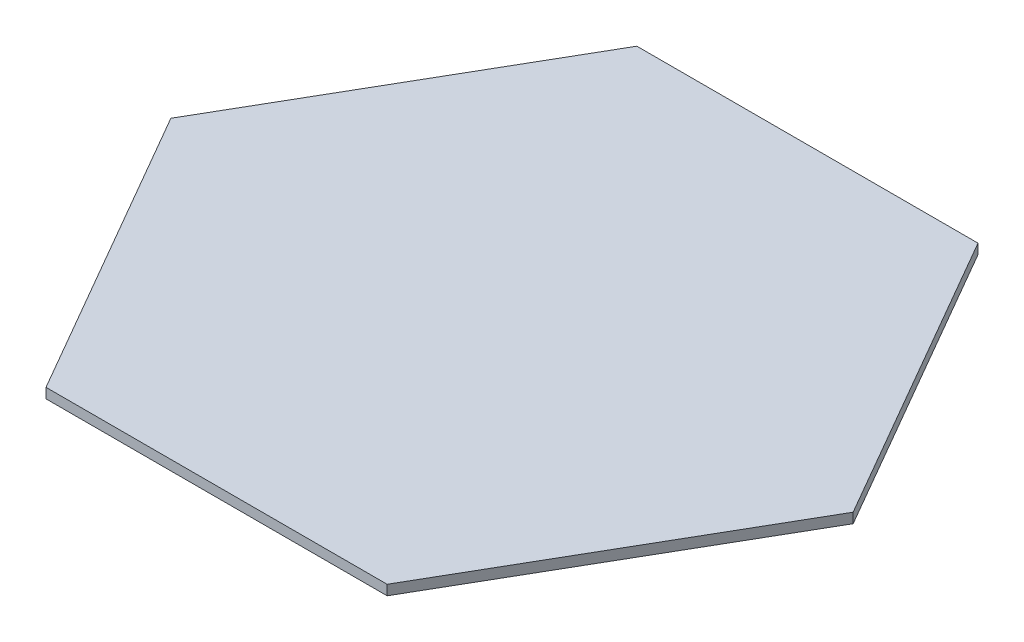
ISO-10303-21;
HEADER;
FILE_DESCRIPTION(('STEP AP214'),'2;1');
FILE_NAME('part.step','',(''),(''),'','','');
FILE_SCHEMA(('AUTOMOTIVE_DESIGN { 1 0 10303 214 1 1 1 1 }'));
ENDSEC;
DATA;
#1=APPLICATION_CONTEXT('core data for automotive mechanical design processes');
#2=APPLICATION_PROTOCOL_DEFINITION('international standard','automotive_design',2000,#1);
#3=PRODUCT_CONTEXT('',#1,'mechanical');
#4=PRODUCT('Part','Part','',(#3));
#5=PRODUCT_RELATED_PRODUCT_CATEGORY('part','',(#4));
#6=PRODUCT_DEFINITION_FORMATION('','',#4);
#7=PRODUCT_DEFINITION_CONTEXT('part definition',#1,'design');
#8=PRODUCT_DEFINITION('design','',#6,#7);
#9=PRODUCT_DEFINITION_SHAPE('','',#8);
#10=(LENGTH_UNIT() NAMED_UNIT(*) SI_UNIT(.MILLI.,.METRE.));
#11=(NAMED_UNIT(*) PLANE_ANGLE_UNIT() SI_UNIT($,.RADIAN.));
#12=(NAMED_UNIT(*) SI_UNIT($,.STERADIAN.) SOLID_ANGLE_UNIT());
#13=UNCERTAINTY_MEASURE_WITH_UNIT(LENGTH_MEASURE(1.E-05),#10,'distance_accuracy_value','');
#14=(GEOMETRIC_REPRESENTATION_CONTEXT(3) GLOBAL_UNCERTAINTY_ASSIGNED_CONTEXT((#13)) GLOBAL_UNIT_ASSIGNED_CONTEXT((#10,
#11,#12)) REPRESENTATION_CONTEXT('',''));
#15=CARTESIAN_POINT('',(0.,0.,0.));
#16=DIRECTION('',(0.,0.,1.));
#17=DIRECTION('',(1.,0.,0.));
#18=AXIS2_PLACEMENT_3D('',#15,#16,#17);
#19=CARTESIAN_POINT('',(-85.25,5.,147.657331345247));
#20=DIRECTION('',(0.,0.,-1.));
#21=DIRECTION('',(-1.,0.,0.));
#22=AXIS2_PLACEMENT_3D('',#19,#20,#21);
#23=PLANE('',#22);
#24=DIRECTION('',(1.,0.,0.));
#25=VECTOR('',#24,1.);
#26=CARTESIAN_POINT('',(-85.25,0.,147.657331345247));
#27=LINE('',#26,#25);
#28=CARTESIAN_POINT('',(-85.25,0.,147.657331345247));
#29=VERTEX_POINT('',#28);
#30=CARTESIAN_POINT('',(85.25,0.,147.657331345247));
#31=VERTEX_POINT('',#30);
#32=EDGE_CURVE('E116',#29,#31,#27,.T.);
#33=ORIENTED_EDGE('',*,*,#32,.T.);
#34=DIRECTION('',(0.,-1.,0.));
#35=VECTOR('',#34,1.);
#36=CARTESIAN_POINT('',(85.25,5.,147.657331345247));
#37=LINE('',#36,#35);
#38=CARTESIAN_POINT('',(85.25,5.,147.657331345247));
#39=VERTEX_POINT('',#38);
#40=EDGE_CURVE('E11',#39,#31,#37,.T.);
#41=ORIENTED_EDGE('',*,*,#40,.F.);
#42=DIRECTION('',(1.,0.,0.));
#43=VECTOR('',#42,1.);
#44=CARTESIAN_POINT('',(-85.25,5.,147.657331345247));
#45=LINE('',#44,#43);
#46=CARTESIAN_POINT('',(-85.25,5.,147.657331345247));
#47=VERTEX_POINT('',#46);
#48=EDGE_CURVE('E126',#47,#39,#45,.T.);
#49=ORIENTED_EDGE('',*,*,#48,.F.);
#50=DIRECTION('',(0.,-1.,0.));
#51=VECTOR('',#50,1.);
#52=CARTESIAN_POINT('',(-85.25,5.,147.657331345247));
#53=LINE('',#52,#51);
#54=EDGE_CURVE('E112',#47,#29,#53,.T.);
#55=ORIENTED_EDGE('',*,*,#54,.T.);
#56=EDGE_LOOP('',(#33,#41,#49,#55));
#57=FACE_BOUND('',#56,.T.);
#58=ADVANCED_FACE('F32',(#57),#23,.F.);
#59=CARTESIAN_POINT('',(85.25,5.,147.657331345247));
#60=DIRECTION('',(-0.866025403784439,0.,-0.5));
#61=DIRECTION('',(-0.5,0.,0.866025403784439));
#62=AXIS2_PLACEMENT_3D('',#59,#60,#61);
#63=PLANE('',#62);
#64=DIRECTION('',(0.5,0.,-0.866025403784439));
#65=VECTOR('',#64,1.);
#66=CARTESIAN_POINT('',(85.25,0.,147.657331345247));
#67=LINE('',#66,#65);
#68=CARTESIAN_POINT('',(170.5,0.,0.));
#69=VERTEX_POINT('',#68);
#70=EDGE_CURVE('E119',#31,#69,#67,.T.);
#71=ORIENTED_EDGE('',*,*,#70,.T.);
#72=DIRECTION('',(0.,-1.,0.));
#73=VECTOR('',#72,1.);
#74=CARTESIAN_POINT('',(170.5,5.,0.));
#75=LINE('',#74,#73);
#76=CARTESIAN_POINT('',(170.5,5.,0.));
#77=VERTEX_POINT('',#76);
#78=EDGE_CURVE('E40',#77,#69,#75,.T.);
#79=ORIENTED_EDGE('',*,*,#78,.F.);
#80=DIRECTION('',(0.5,0.,-0.866025403784439));
#81=VECTOR('',#80,1.);
#82=CARTESIAN_POINT('',(85.25,5.,147.657331345247));
#83=LINE('',#82,#81);
#84=EDGE_CURVE('E85',#39,#77,#83,.T.);
#85=ORIENTED_EDGE('',*,*,#84,.F.);
#86=ORIENTED_EDGE('',*,*,#40,.T.);
#87=EDGE_LOOP('',(#71,#79,#85,#86));
#88=FACE_BOUND('',#87,.T.);
#89=ADVANCED_FACE('F150',(#88),#63,.F.);
#90=CARTESIAN_POINT('',(170.5,5.,0.));
#91=DIRECTION('',(-0.866025403784439,0.,0.5));
#92=DIRECTION('',(0.5,0.,0.866025403784439));
#93=AXIS2_PLACEMENT_3D('',#90,#91,#92);
#94=PLANE('',#93);
#95=DIRECTION('',(-0.5,0.,-0.866025403784439));
#96=VECTOR('',#95,1.);
#97=CARTESIAN_POINT('',(170.5,0.,0.));
#98=LINE('',#97,#96);
#99=CARTESIAN_POINT('',(85.25,0.,-147.657331345247));
#100=VERTEX_POINT('',#99);
#101=EDGE_CURVE('E121',#69,#100,#98,.T.);
#102=ORIENTED_EDGE('',*,*,#101,.T.);
#103=DIRECTION('',(0.,-1.,0.));
#104=VECTOR('',#103,1.);
#105=CARTESIAN_POINT('',(85.25,5.,-147.657331345247));
#106=LINE('',#105,#104);
#107=CARTESIAN_POINT('',(85.25,5.,-147.657331345247));
#108=VERTEX_POINT('',#107);
#109=EDGE_CURVE('E107',#108,#100,#106,.T.);
#110=ORIENTED_EDGE('',*,*,#109,.F.);
#111=DIRECTION('',(-0.5,0.,-0.866025403784439));
#112=VECTOR('',#111,1.);
#113=CARTESIAN_POINT('',(170.5,5.,0.));
#114=LINE('',#113,#112);
#115=EDGE_CURVE('E98',#77,#108,#114,.T.);
#116=ORIENTED_EDGE('',*,*,#115,.F.);
#117=ORIENTED_EDGE('',*,*,#78,.T.);
#118=EDGE_LOOP('',(#102,#110,#116,#117));
#119=FACE_BOUND('',#118,.T.);
#120=ADVANCED_FACE('F132',(#119),#94,.F.);
#121=CARTESIAN_POINT('',(85.25,5.,-147.657331345247));
#122=DIRECTION('',(0.,0.,1.));
#123=DIRECTION('',(1.,0.,0.));
#124=AXIS2_PLACEMENT_3D('',#121,#122,#123);
#125=PLANE('',#124);
#126=DIRECTION('',(-1.,0.,0.));
#127=VECTOR('',#126,1.);
#128=CARTESIAN_POINT('',(85.25,0.,-147.657331345247));
#129=LINE('',#128,#127);
#130=CARTESIAN_POINT('',(-85.25,0.,-147.657331345247));
#131=VERTEX_POINT('',#130);
#132=EDGE_CURVE('E106',#100,#131,#129,.T.);
#133=ORIENTED_EDGE('',*,*,#132,.T.);
#134=DIRECTION('',(0.,-1.,0.));
#135=VECTOR('',#134,1.);
#136=CARTESIAN_POINT('',(-85.25,5.,-147.657331345247));
#137=LINE('',#136,#135);
#138=CARTESIAN_POINT('',(-85.25,5.,-147.657331345247));
#139=VERTEX_POINT('',#138);
#140=EDGE_CURVE('E103',#139,#131,#137,.T.);
#141=ORIENTED_EDGE('',*,*,#140,.F.);
#142=DIRECTION('',(-1.,0.,0.));
#143=VECTOR('',#142,1.);
#144=CARTESIAN_POINT('',(85.25,5.,-147.657331345247));
#145=LINE('',#144,#143);
#146=EDGE_CURVE('E92',#108,#139,#145,.T.);
#147=ORIENTED_EDGE('',*,*,#146,.F.);
#148=ORIENTED_EDGE('',*,*,#109,.T.);
#149=EDGE_LOOP('',(#133,#141,#147,#148));
#150=FACE_BOUND('',#149,.T.);
#151=ADVANCED_FACE('F104',(#150),#125,.F.);
#152=CARTESIAN_POINT('',(-85.25,5.,-147.657331345247));
#153=DIRECTION('',(0.866025403784439,0.,0.5));
#154=DIRECTION('',(0.5,0.,-0.866025403784439));
#155=AXIS2_PLACEMENT_3D('',#152,#153,#154);
#156=PLANE('',#155);
#157=DIRECTION('',(-0.5,0.,0.866025403784439));
#158=VECTOR('',#157,1.);
#159=CARTESIAN_POINT('',(-85.25,0.,-147.657331345247));
#160=LINE('',#159,#158);
#161=CARTESIAN_POINT('',(-170.5,0.,0.));
#162=VERTEX_POINT('',#161);
#163=EDGE_CURVE('E71',#131,#162,#160,.T.);
#164=ORIENTED_EDGE('',*,*,#163,.T.);
#165=DIRECTION('',(0.,-1.,0.));
#166=VECTOR('',#165,1.);
#167=CARTESIAN_POINT('',(-170.5,5.,0.));
#168=LINE('',#167,#166);
#169=CARTESIAN_POINT('',(-170.5,5.,0.));
#170=VERTEX_POINT('',#169);
#171=EDGE_CURVE('E108',#170,#162,#168,.T.);
#172=ORIENTED_EDGE('',*,*,#171,.F.);
#173=DIRECTION('',(-0.5,0.,0.866025403784439));
#174=VECTOR('',#173,1.);
#175=CARTESIAN_POINT('',(-85.25,5.,-147.657331345247));
#176=LINE('',#175,#174);
#177=EDGE_CURVE('E96',#139,#170,#176,.T.);
#178=ORIENTED_EDGE('',*,*,#177,.F.);
#179=ORIENTED_EDGE('',*,*,#140,.T.);
#180=EDGE_LOOP('',(#164,#172,#178,#179));
#181=FACE_BOUND('',#180,.T.);
#182=ADVANCED_FACE('F110',(#181),#156,.F.);
#183=CARTESIAN_POINT('',(-170.5,5.,0.));
#184=DIRECTION('',(0.866025403784439,0.,-0.5));
#185=DIRECTION('',(-0.5,0.,-0.866025403784439));
#186=AXIS2_PLACEMENT_3D('',#183,#184,#185);
#187=PLANE('',#186);
#188=DIRECTION('',(0.5,0.,0.866025403784439));
#189=VECTOR('',#188,1.);
#190=CARTESIAN_POINT('',(-170.5,0.,0.));
#191=LINE('',#190,#189);
#192=EDGE_CURVE('E77',#162,#29,#191,.T.);
#193=ORIENTED_EDGE('',*,*,#192,.T.);
#194=ORIENTED_EDGE('',*,*,#54,.F.);
#195=DIRECTION('',(0.5,0.,0.866025403784439));
#196=VECTOR('',#195,1.);
#197=CARTESIAN_POINT('',(-170.5,5.,0.));
#198=LINE('',#197,#196);
#199=EDGE_CURVE('E48',#170,#47,#198,.T.);
#200=ORIENTED_EDGE('',*,*,#199,.F.);
#201=ORIENTED_EDGE('',*,*,#171,.T.);
#202=EDGE_LOOP('',(#193,#194,#200,#201));
#203=FACE_BOUND('',#202,.T.);
#204=ADVANCED_FACE('F139',(#203),#187,.F.);
#205=CARTESIAN_POINT('',(0.,5.,0.));
#206=DIRECTION('',(0.,1.,0.));
#207=DIRECTION('',(0.,0.,1.));
#208=AXIS2_PLACEMENT_3D('',#205,#206,#207);
#209=PLANE('',#208);
#210=ORIENTED_EDGE('',*,*,#48,.T.);
#211=ORIENTED_EDGE('',*,*,#84,.T.);
#212=ORIENTED_EDGE('',*,*,#115,.T.);
#213=ORIENTED_EDGE('',*,*,#146,.T.);
#214=ORIENTED_EDGE('',*,*,#177,.T.);
#215=ORIENTED_EDGE('',*,*,#199,.T.);
#216=EDGE_LOOP('',(#210,#211,#212,#213,#214,#215));
#217=FACE_BOUND('',#216,.T.);
#218=ADVANCED_FACE('F94',(#217),#209,.T.);
#219=CARTESIAN_POINT('',(0.,0.,0.));
#220=DIRECTION('',(0.,1.,0.));
#221=DIRECTION('',(0.,0.,1.));
#222=AXIS2_PLACEMENT_3D('',#219,#220,#221);
#223=PLANE('',#222);
#224=ORIENTED_EDGE('',*,*,#32,.F.);
#225=ORIENTED_EDGE('',*,*,#192,.F.);
#226=ORIENTED_EDGE('',*,*,#163,.F.);
#227=ORIENTED_EDGE('',*,*,#132,.F.);
#228=ORIENTED_EDGE('',*,*,#101,.F.);
#229=ORIENTED_EDGE('',*,*,#70,.F.);
#230=EDGE_LOOP('',(#224,#225,#226,#227,#228,#229));
#231=FACE_BOUND('',#230,.T.);
#232=ADVANCED_FACE('F135',(#231),#223,.F.);
#233=CLOSED_SHELL('',(#58,#89,#120,#151,#182,#204,#218,#232));
#234=MANIFOLD_SOLID_BREP('B2',#233);
#235=ADVANCED_BREP_SHAPE_REPRESENTATION('',(#18,#234),#14);
#236=SHAPE_DEFINITION_REPRESENTATION(#9,#235);
ENDSEC;
END-ISO-10303-21;
